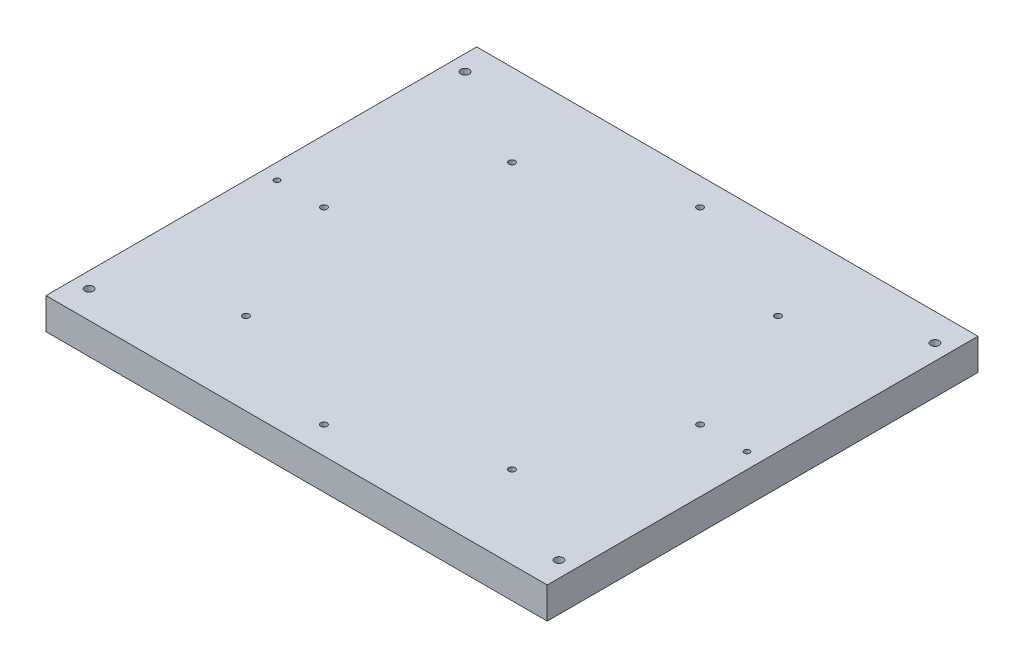
ISO-10303-21;
HEADER;
FILE_DESCRIPTION(('STEP AP214'),'2;1');
FILE_NAME('part.step','',(''),(''),'','','');
FILE_SCHEMA(('AUTOMOTIVE_DESIGN { 1 0 10303 214 1 1 1 1 }'));
ENDSEC;
DATA;
#1=APPLICATION_CONTEXT('core data for automotive mechanical design processes');
#2=APPLICATION_PROTOCOL_DEFINITION('international standard','automotive_design',2000,#1);
#3=PRODUCT_CONTEXT('',#1,'mechanical');
#4=PRODUCT('Part','Part','',(#3));
#5=PRODUCT_RELATED_PRODUCT_CATEGORY('part','',(#4));
#6=PRODUCT_DEFINITION_FORMATION('','',#4);
#7=PRODUCT_DEFINITION_CONTEXT('part definition',#1,'design');
#8=PRODUCT_DEFINITION('design','',#6,#7);
#9=PRODUCT_DEFINITION_SHAPE('','',#8);
#10=(LENGTH_UNIT() NAMED_UNIT(*) SI_UNIT(.MILLI.,.METRE.));
#11=(NAMED_UNIT(*) PLANE_ANGLE_UNIT() SI_UNIT($,.RADIAN.));
#12=(NAMED_UNIT(*) SI_UNIT($,.STERADIAN.) SOLID_ANGLE_UNIT());
#13=UNCERTAINTY_MEASURE_WITH_UNIT(LENGTH_MEASURE(1.E-05),#10,'distance_accuracy_value','');
#14=(GEOMETRIC_REPRESENTATION_CONTEXT(3) GLOBAL_UNCERTAINTY_ASSIGNED_CONTEXT((#13)) GLOBAL_UNIT_ASSIGNED_CONTEXT((#10,
#11,#12)) REPRESENTATION_CONTEXT('',''));
#15=CARTESIAN_POINT('',(0.,0.,0.));
#16=DIRECTION('',(0.,0.,1.));
#17=DIRECTION('',(1.,0.,0.));
#18=AXIS2_PLACEMENT_3D('',#15,#16,#17);
#19=CARTESIAN_POINT('',(204.7875,25.4,173.0375));
#20=DIRECTION('',(-1.,0.,0.));
#21=DIRECTION('',(0.,0.,1.));
#22=AXIS2_PLACEMENT_3D('',#19,#20,#21);
#23=PLANE('',#22);
#24=DIRECTION('',(0.,0.,-1.));
#25=VECTOR('',#24,1.);
#26=CARTESIAN_POINT('',(204.7875,0.,173.0375));
#27=LINE('',#26,#25);
#28=CARTESIAN_POINT('',(204.7875,0.,173.0375));
#29=VERTEX_POINT('',#28);
#30=CARTESIAN_POINT('',(204.7875,0.,-176.2125));
#31=VERTEX_POINT('',#30);
#32=EDGE_CURVE('E102',#29,#31,#27,.T.);
#33=ORIENTED_EDGE('',*,*,#32,.T.);
#34=DIRECTION('',(0.,-1.,0.));
#35=VECTOR('',#34,1.);
#36=CARTESIAN_POINT('',(204.7875,25.4,-176.2125));
#37=LINE('',#36,#35);
#38=CARTESIAN_POINT('',(204.7875,25.4,-176.2125));
#39=VERTEX_POINT('',#38);
#40=EDGE_CURVE('E11',#39,#31,#37,.T.);
#41=ORIENTED_EDGE('',*,*,#40,.F.);
#42=DIRECTION('',(0.,0.,-1.));
#43=VECTOR('',#42,1.);
#44=CARTESIAN_POINT('',(204.7875,25.4,173.0375));
#45=LINE('',#44,#43);
#46=CARTESIAN_POINT('',(204.7875,25.4,173.0375));
#47=VERTEX_POINT('',#46);
#48=EDGE_CURVE('E89',#47,#39,#45,.T.);
#49=ORIENTED_EDGE('',*,*,#48,.F.);
#50=DIRECTION('',(0.,-1.,0.));
#51=VECTOR('',#50,1.);
#52=CARTESIAN_POINT('',(204.7875,25.4,173.0375));
#53=LINE('',#52,#51);
#54=EDGE_CURVE('E98',#47,#29,#53,.T.);
#55=ORIENTED_EDGE('',*,*,#54,.T.);
#56=EDGE_LOOP('',(#33,#41,#49,#55));
#57=FACE_BOUND('',#56,.T.);
#58=ADVANCED_FACE('F36',(#57),#23,.F.);
#59=CARTESIAN_POINT('',(-201.6125,25.4,-176.2125));
#60=DIRECTION('',(0.,0.,1.));
#61=DIRECTION('',(1.,0.,0.));
#62=AXIS2_PLACEMENT_3D('',#59,#60,#61);
#63=PLANE('',#62);
#64=DIRECTION('',(-1.,0.,0.));
#65=VECTOR('',#64,1.);
#66=CARTESIAN_POINT('',(-201.6125,0.,-176.2125));
#67=LINE('',#66,#65);
#68=CARTESIAN_POINT('',(-201.6125,0.,-176.2125));
#69=VERTEX_POINT('',#68);
#70=EDGE_CURVE('E93',#31,#69,#67,.T.);
#71=ORIENTED_EDGE('',*,*,#70,.T.);
#72=DIRECTION('',(0.,-1.,0.));
#73=VECTOR('',#72,1.);
#74=CARTESIAN_POINT('',(-201.6125,25.4,-176.2125));
#75=LINE('',#74,#73);
#76=CARTESIAN_POINT('',(-201.6125,25.4,-176.2125));
#77=VERTEX_POINT('',#76);
#78=EDGE_CURVE('E45',#77,#69,#75,.T.);
#79=ORIENTED_EDGE('',*,*,#78,.F.);
#80=DIRECTION('',(-1.,0.,0.));
#81=VECTOR('',#80,1.);
#82=CARTESIAN_POINT('',(-201.6125,25.4,-176.2125));
#83=LINE('',#82,#81);
#84=EDGE_CURVE('E84',#39,#77,#83,.T.);
#85=ORIENTED_EDGE('',*,*,#84,.F.);
#86=ORIENTED_EDGE('',*,*,#40,.T.);
#87=EDGE_LOOP('',(#71,#79,#85,#86));
#88=FACE_BOUND('',#87,.T.);
#89=ADVANCED_FACE('F92',(#88),#63,.F.);
#90=CARTESIAN_POINT('',(-201.6125,25.4,173.0375));
#91=DIRECTION('',(1.,0.,0.));
#92=DIRECTION('',(0.,0.,-1.));
#93=AXIS2_PLACEMENT_3D('',#90,#91,#92);
#94=PLANE('',#93);
#95=DIRECTION('',(0.,0.,1.));
#96=VECTOR('',#95,1.);
#97=CARTESIAN_POINT('',(-201.6125,0.,173.0375));
#98=LINE('',#97,#96);
#99=CARTESIAN_POINT('',(-201.6125,0.,173.0375));
#100=VERTEX_POINT('',#99);
#101=EDGE_CURVE('E71',#69,#100,#98,.T.);
#102=ORIENTED_EDGE('',*,*,#101,.T.);
#103=DIRECTION('',(0.,-1.,0.));
#104=VECTOR('',#103,1.);
#105=CARTESIAN_POINT('',(-201.6125,25.4,173.0375));
#106=LINE('',#105,#104);
#107=CARTESIAN_POINT('',(-201.6125,25.4,173.0375));
#108=VERTEX_POINT('',#107);
#109=EDGE_CURVE('E94',#108,#100,#106,.T.);
#110=ORIENTED_EDGE('',*,*,#109,.F.);
#111=DIRECTION('',(0.,0.,1.));
#112=VECTOR('',#111,1.);
#113=CARTESIAN_POINT('',(-201.6125,25.4,173.0375));
#114=LINE('',#113,#112);
#115=EDGE_CURVE('E87',#77,#108,#114,.T.);
#116=ORIENTED_EDGE('',*,*,#115,.F.);
#117=ORIENTED_EDGE('',*,*,#78,.T.);
#118=EDGE_LOOP('',(#102,#110,#116,#117));
#119=FACE_BOUND('',#118,.T.);
#120=ADVANCED_FACE('F96',(#119),#94,.F.);
#121=CARTESIAN_POINT('',(-201.6125,25.4,173.0375));
#122=DIRECTION('',(0.,0.,-1.));
#123=DIRECTION('',(-1.,0.,0.));
#124=AXIS2_PLACEMENT_3D('',#121,#122,#123);
#125=PLANE('',#124);
#126=DIRECTION('',(1.,0.,0.));
#127=VECTOR('',#126,1.);
#128=CARTESIAN_POINT('',(-201.6125,0.,173.0375));
#129=LINE('',#128,#127);
#130=EDGE_CURVE('E77',#100,#29,#129,.T.);
#131=ORIENTED_EDGE('',*,*,#130,.T.);
#132=ORIENTED_EDGE('',*,*,#54,.F.);
#133=DIRECTION('',(1.,0.,0.));
#134=VECTOR('',#133,1.);
#135=CARTESIAN_POINT('',(-201.6125,25.4,173.0375));
#136=LINE('',#135,#134);
#137=EDGE_CURVE('E54',#108,#47,#136,.T.);
#138=ORIENTED_EDGE('',*,*,#137,.F.);
#139=ORIENTED_EDGE('',*,*,#109,.T.);
#140=EDGE_LOOP('',(#131,#132,#138,#139));
#141=FACE_BOUND('',#140,.T.);
#142=ADVANCED_FACE('F205',(#141),#125,.F.);
#143=CARTESIAN_POINT('',(204.7875,25.4,-176.2125));
#144=DIRECTION('',(0.,-1.,0.));
#145=DIRECTION('',(0.,0.,-1.));
#146=AXIS2_PLACEMENT_3D('',#143,#144,#145);
#147=PLANE('',#146);
#148=CARTESIAN_POINT('',(1.58749999999996,25.4,-154.072248935754));
#149=DIRECTION('',(0.,1.,0.));
#150=DIRECTION('',(0.,0.,1.));
#151=AXIS2_PLACEMENT_3D('',#148,#149,#150);
#152=CIRCLE('',#151,2.55269999999999);
#153=CARTESIAN_POINT('',(1.58749999999996,25.4,-151.519548935754));
#154=VERTEX_POINT('',#153);
#155=EDGE_CURVE('E156',#154,#154,#152,.T.);
#156=ORIENTED_EDGE('',*,*,#155,.F.);
#157=EDGE_LOOP('',(#156));
#158=FACE_BOUND('',#157,.T.);
#159=CARTESIAN_POINT('',(-106.2355,25.4,-109.4105));
#160=DIRECTION('',(0.,1.,0.));
#161=DIRECTION('',(0.,0.,1.));
#162=AXIS2_PLACEMENT_3D('',#159,#160,#161);
#163=CIRCLE('',#162,2.55269999999999);
#164=CARTESIAN_POINT('',(-106.2355,25.4,-106.8578));
#165=VERTEX_POINT('',#164);
#166=EDGE_CURVE('E146',#165,#165,#163,.T.);
#167=ORIENTED_EDGE('',*,*,#166,.F.);
#168=EDGE_LOOP('',(#167));
#169=FACE_BOUND('',#168,.T.);
#170=CARTESIAN_POINT('',(109.4105,25.4,-109.4105));
#171=DIRECTION('',(0.,1.,0.));
#172=DIRECTION('',(0.,0.,1.));
#173=AXIS2_PLACEMENT_3D('',#170,#171,#172);
#174=CIRCLE('',#173,2.55269999999999);
#175=CARTESIAN_POINT('',(109.4105,25.4,-106.8578));
#176=VERTEX_POINT('',#175);
#177=EDGE_CURVE('E143',#176,#176,#174,.T.);
#178=ORIENTED_EDGE('',*,*,#177,.F.);
#179=EDGE_LOOP('',(#178));
#180=FACE_BOUND('',#179,.T.);
#181=CARTESIAN_POINT('',(154.072248935754,25.4,-1.58750000000007));
#182=DIRECTION('',(0.,1.,0.));
#183=DIRECTION('',(0.,0.,1.));
#184=AXIS2_PLACEMENT_3D('',#181,#182,#183);
#185=CIRCLE('',#184,2.55269999999999);
#186=CARTESIAN_POINT('',(154.072248935754,25.4,0.965199999999916));
#187=VERTEX_POINT('',#186);
#188=EDGE_CURVE('E140',#187,#187,#185,.T.);
#189=ORIENTED_EDGE('',*,*,#188,.F.);
#190=EDGE_LOOP('',(#189));
#191=FACE_BOUND('',#190,.T.);
#192=CARTESIAN_POINT('',(-150.897248935754,25.4,-1.58750000000005));
#193=DIRECTION('',(0.,1.,0.));
#194=DIRECTION('',(0.,0.,1.));
#195=AXIS2_PLACEMENT_3D('',#192,#193,#194);
#196=CIRCLE('',#195,2.55269999999999);
#197=CARTESIAN_POINT('',(-150.897248935754,25.4,0.965199999999944));
#198=VERTEX_POINT('',#197);
#199=EDGE_CURVE('E136',#198,#198,#196,.T.);
#200=ORIENTED_EDGE('',*,*,#199,.F.);
#201=EDGE_LOOP('',(#200));
#202=FACE_BOUND('',#201,.T.);
#203=CARTESIAN_POINT('',(-106.2355,25.4,106.2355));
#204=DIRECTION('',(0.,1.,0.));
#205=DIRECTION('',(0.,0.,1.));
#206=AXIS2_PLACEMENT_3D('',#203,#204,#205);
#207=CIRCLE('',#206,2.55269999999999);
#208=CARTESIAN_POINT('',(-106.2355,25.4,108.7882));
#209=VERTEX_POINT('',#208);
#210=EDGE_CURVE('E135',#209,#209,#207,.T.);
#211=ORIENTED_EDGE('',*,*,#210,.F.);
#212=EDGE_LOOP('',(#211));
#213=FACE_BOUND('',#212,.T.);
#214=CARTESIAN_POINT('',(1.58749999999996,25.4,150.897248935754));
#215=DIRECTION('',(0.,1.,0.));
#216=DIRECTION('',(0.,0.,1.));
#217=AXIS2_PLACEMENT_3D('',#214,#215,#216);
#218=CIRCLE('',#217,2.55269999999999);
#219=CARTESIAN_POINT('',(1.58749999999996,25.4,153.449948935754));
#220=VERTEX_POINT('',#219);
#221=EDGE_CURVE('E168',#220,#220,#218,.T.);
#222=ORIENTED_EDGE('',*,*,#221,.F.);
#223=EDGE_LOOP('',(#222));
#224=FACE_BOUND('',#223,.T.);
#225=CARTESIAN_POINT('',(109.4105,25.4,106.2355));
#226=DIRECTION('',(0.,1.,0.));
#227=DIRECTION('',(0.,0.,1.));
#228=AXIS2_PLACEMENT_3D('',#225,#226,#227);
#229=CIRCLE('',#228,2.55269999999999);
#230=CARTESIAN_POINT('',(109.4105,25.4,108.7882));
#231=VERTEX_POINT('',#230);
#232=EDGE_CURVE('E174',#231,#231,#229,.T.);
#233=ORIENTED_EDGE('',*,*,#232,.F.);
#234=EDGE_LOOP('',(#233));
#235=FACE_BOUND('',#234,.T.);
#236=CARTESIAN_POINT('',(-188.9125,25.4,-1.58750000000002));
#237=DIRECTION('',(0.,1.,0.));
#238=DIRECTION('',(0.,0.,1.));
#239=AXIS2_PLACEMENT_3D('',#236,#237,#238);
#240=CIRCLE('',#239,2.2479);
#241=CARTESIAN_POINT('',(-188.9125,25.4,0.660399999999973));
#242=VERTEX_POINT('',#241);
#243=EDGE_CURVE('E131',#242,#242,#240,.T.);
#244=ORIENTED_EDGE('',*,*,#243,.F.);
#245=EDGE_LOOP('',(#244));
#246=FACE_BOUND('',#245,.T.);
#247=CARTESIAN_POINT('',(192.0875,25.4,-1.58750000000005));
#248=DIRECTION('',(0.,1.,0.));
#249=DIRECTION('',(0.,0.,1.));
#250=AXIS2_PLACEMENT_3D('',#247,#248,#249);
#251=CIRCLE('',#250,2.2479);
#252=CARTESIAN_POINT('',(192.0875,25.4,0.66039999999995));
#253=VERTEX_POINT('',#252);
#254=EDGE_CURVE('E127',#253,#253,#251,.T.);
#255=ORIENTED_EDGE('',*,*,#254,.F.);
#256=EDGE_LOOP('',(#255));
#257=FACE_BOUND('',#256,.T.);
#258=CARTESIAN_POINT('',(-188.9125,25.4,-153.9875));
#259=DIRECTION('',(0.,1.,0.));
#260=DIRECTION('',(0.,0.,1.));
#261=AXIS2_PLACEMENT_3D('',#258,#259,#260);
#262=CIRCLE('',#261,3.3782);
#263=CARTESIAN_POINT('',(-188.9125,25.4,-150.6093));
#264=VERTEX_POINT('',#263);
#265=EDGE_CURVE('E123',#264,#264,#262,.T.);
#266=ORIENTED_EDGE('',*,*,#265,.F.);
#267=EDGE_LOOP('',(#266));
#268=FACE_BOUND('',#267,.T.);
#269=CARTESIAN_POINT('',(192.0875,25.4,-153.9875));
#270=DIRECTION('',(0.,1.,0.));
#271=DIRECTION('',(0.,0.,1.));
#272=AXIS2_PLACEMENT_3D('',#269,#270,#271);
#273=CIRCLE('',#272,3.3782);
#274=CARTESIAN_POINT('',(192.0875,25.4,-150.6093));
#275=VERTEX_POINT('',#274);
#276=EDGE_CURVE('E119',#275,#275,#273,.T.);
#277=ORIENTED_EDGE('',*,*,#276,.F.);
#278=EDGE_LOOP('',(#277));
#279=FACE_BOUND('',#278,.T.);
#280=CARTESIAN_POINT('',(192.0875,25.4,150.8125));
#281=DIRECTION('',(0.,1.,0.));
#282=DIRECTION('',(0.,0.,1.));
#283=AXIS2_PLACEMENT_3D('',#280,#281,#282);
#284=CIRCLE('',#283,3.3782);
#285=CARTESIAN_POINT('',(192.0875,25.4,154.1907));
#286=VERTEX_POINT('',#285);
#287=EDGE_CURVE('E115',#286,#286,#284,.T.);
#288=ORIENTED_EDGE('',*,*,#287,.F.);
#289=EDGE_LOOP('',(#288));
#290=FACE_BOUND('',#289,.T.);
#291=CARTESIAN_POINT('',(-188.9125,25.4,150.8125));
#292=DIRECTION('',(0.,1.,0.));
#293=DIRECTION('',(0.,0.,1.));
#294=AXIS2_PLACEMENT_3D('',#291,#292,#293);
#295=CIRCLE('',#294,3.3782);
#296=CARTESIAN_POINT('',(-188.9125,25.4,154.1907));
#297=VERTEX_POINT('',#296);
#298=EDGE_CURVE('E114',#297,#297,#295,.T.);
#299=ORIENTED_EDGE('',*,*,#298,.F.);
#300=EDGE_LOOP('',(#299));
#301=FACE_BOUND('',#300,.T.);
#302=ORIENTED_EDGE('',*,*,#48,.T.);
#303=ORIENTED_EDGE('',*,*,#84,.T.);
#304=ORIENTED_EDGE('',*,*,#115,.T.);
#305=ORIENTED_EDGE('',*,*,#137,.T.);
#306=EDGE_LOOP('',(#302,#303,#304,#305));
#307=FACE_BOUND('',#306,.T.);
#308=ADVANCED_FACE('F85',(#158,#169,#180,#191,#202,#213,#224,#235,#246,#257,#268,#279,#290,#301,
#307),#147,.F.);
#309=CARTESIAN_POINT('',(204.7875,0.,-176.2125));
#310=DIRECTION('',(0.,-1.,0.));
#311=DIRECTION('',(0.,0.,-1.));
#312=AXIS2_PLACEMENT_3D('',#309,#310,#311);
#313=PLANE('',#312);
#314=CARTESIAN_POINT('',(1.58749999999996,0.,-154.072248935754));
#315=DIRECTION('',(0.,-1.,0.));
#316=DIRECTION('',(0.,0.,-1.));
#317=AXIS2_PLACEMENT_3D('',#314,#315,#316);
#318=CIRCLE('',#317,2.55269999999999);
#319=CARTESIAN_POINT('',(1.58749999999996,0.,-156.624948935754));
#320=VERTEX_POINT('',#319);
#321=EDGE_CURVE('E39',#320,#320,#318,.T.);
#322=ORIENTED_EDGE('',*,*,#321,.F.);
#323=EDGE_LOOP('',(#322));
#324=FACE_BOUND('',#323,.T.);
#325=CARTESIAN_POINT('',(-106.2355,0.,-109.4105));
#326=DIRECTION('',(0.,-1.,0.));
#327=DIRECTION('',(0.,0.,-1.));
#328=AXIS2_PLACEMENT_3D('',#325,#326,#327);
#329=CIRCLE('',#328,2.55269999999998);
#330=CARTESIAN_POINT('',(-106.2355,0.,-111.9632));
#331=VERTEX_POINT('',#330);
#332=EDGE_CURVE('E144',#331,#331,#329,.T.);
#333=ORIENTED_EDGE('',*,*,#332,.F.);
#334=EDGE_LOOP('',(#333));
#335=FACE_BOUND('',#334,.T.);
#336=CARTESIAN_POINT('',(109.4105,0.,-109.4105));
#337=DIRECTION('',(0.,-1.,0.));
#338=DIRECTION('',(0.,0.,-1.));
#339=AXIS2_PLACEMENT_3D('',#336,#337,#338);
#340=CIRCLE('',#339,2.55269999999998);
#341=CARTESIAN_POINT('',(109.4105,0.,-111.9632));
#342=VERTEX_POINT('',#341);
#343=EDGE_CURVE('E141',#342,#342,#340,.T.);
#344=ORIENTED_EDGE('',*,*,#343,.F.);
#345=EDGE_LOOP('',(#344));
#346=FACE_BOUND('',#345,.T.);
#347=CARTESIAN_POINT('',(154.072248935754,0.,-1.58750000000007));
#348=DIRECTION('',(0.,-1.,0.));
#349=DIRECTION('',(0.,0.,-1.));
#350=AXIS2_PLACEMENT_3D('',#347,#348,#349);
#351=CIRCLE('',#350,2.55269999999999);
#352=CARTESIAN_POINT('',(154.072248935754,0.,-4.14020000000007));
#353=VERTEX_POINT('',#352);
#354=EDGE_CURVE('E137',#353,#353,#351,.T.);
#355=ORIENTED_EDGE('',*,*,#354,.F.);
#356=EDGE_LOOP('',(#355));
#357=FACE_BOUND('',#356,.T.);
#358=CARTESIAN_POINT('',(-150.897248935754,0.,-1.58750000000005));
#359=DIRECTION('',(0.,-1.,0.));
#360=DIRECTION('',(0.,0.,-1.));
#361=AXIS2_PLACEMENT_3D('',#358,#359,#360);
#362=CIRCLE('',#361,2.55269999999999);
#363=CARTESIAN_POINT('',(-150.897248935754,0.,-4.14020000000004));
#364=VERTEX_POINT('',#363);
#365=EDGE_CURVE('E132',#364,#364,#362,.T.);
#366=ORIENTED_EDGE('',*,*,#365,.F.);
#367=EDGE_LOOP('',(#366));
#368=FACE_BOUND('',#367,.T.);
#369=CARTESIAN_POINT('',(-106.2355,0.,106.2355));
#370=DIRECTION('',(0.,-1.,0.));
#371=DIRECTION('',(0.,0.,-1.));
#372=AXIS2_PLACEMENT_3D('',#369,#370,#371);
#373=CIRCLE('',#372,2.55269999999998);
#374=CARTESIAN_POINT('',(-106.2355,0.,103.6828));
#375=VERTEX_POINT('',#374);
#376=EDGE_CURVE('E165',#375,#375,#373,.T.);
#377=ORIENTED_EDGE('',*,*,#376,.F.);
#378=EDGE_LOOP('',(#377));
#379=FACE_BOUND('',#378,.T.);
#380=CARTESIAN_POINT('',(1.58749999999996,0.,150.897248935754));
#381=DIRECTION('',(0.,-1.,0.));
#382=DIRECTION('',(0.,0.,-1.));
#383=AXIS2_PLACEMENT_3D('',#380,#381,#382);
#384=CIRCLE('',#383,2.55269999999999);
#385=CARTESIAN_POINT('',(1.58749999999996,0.,148.344548935754));
#386=VERTEX_POINT('',#385);
#387=EDGE_CURVE('E171',#386,#386,#384,.T.);
#388=ORIENTED_EDGE('',*,*,#387,.F.);
#389=EDGE_LOOP('',(#388));
#390=FACE_BOUND('',#389,.T.);
#391=CARTESIAN_POINT('',(109.4105,0.,106.2355));
#392=DIRECTION('',(0.,-1.,0.));
#393=DIRECTION('',(0.,0.,-1.));
#394=AXIS2_PLACEMENT_3D('',#391,#392,#393);
#395=CIRCLE('',#394,2.55269999999998);
#396=CARTESIAN_POINT('',(109.4105,0.,103.6828));
#397=VERTEX_POINT('',#396);
#398=EDGE_CURVE('E177',#397,#397,#395,.T.);
#399=ORIENTED_EDGE('',*,*,#398,.F.);
#400=EDGE_LOOP('',(#399));
#401=FACE_BOUND('',#400,.T.);
#402=CARTESIAN_POINT('',(-188.9125,0.,-1.58750000000002));
#403=DIRECTION('',(0.,-1.,0.));
#404=DIRECTION('',(0.,0.,-1.));
#405=AXIS2_PLACEMENT_3D('',#402,#403,#404);
#406=CIRCLE('',#405,2.24789999999998);
#407=CARTESIAN_POINT('',(-188.9125,0.,-3.83540000000001));
#408=VERTEX_POINT('',#407);
#409=EDGE_CURVE('E128',#408,#408,#406,.T.);
#410=ORIENTED_EDGE('',*,*,#409,.F.);
#411=EDGE_LOOP('',(#410));
#412=FACE_BOUND('',#411,.T.);
#413=CARTESIAN_POINT('',(192.0875,0.,-1.58750000000005));
#414=DIRECTION('',(0.,-1.,0.));
#415=DIRECTION('',(0.,0.,-1.));
#416=AXIS2_PLACEMENT_3D('',#413,#414,#415);
#417=CIRCLE('',#416,2.24789999999998);
#418=CARTESIAN_POINT('',(192.0875,0.,-3.83540000000003));
#419=VERTEX_POINT('',#418);
#420=EDGE_CURVE('E124',#419,#419,#417,.T.);
#421=ORIENTED_EDGE('',*,*,#420,.F.);
#422=EDGE_LOOP('',(#421));
#423=FACE_BOUND('',#422,.T.);
#424=CARTESIAN_POINT('',(-188.9125,0.,-153.9875));
#425=DIRECTION('',(0.,-1.,0.));
#426=DIRECTION('',(0.,0.,-1.));
#427=AXIS2_PLACEMENT_3D('',#424,#425,#426);
#428=CIRCLE('',#427,3.37819999999998);
#429=CARTESIAN_POINT('',(-188.9125,0.,-157.3657));
#430=VERTEX_POINT('',#429);
#431=EDGE_CURVE('E120',#430,#430,#428,.T.);
#432=ORIENTED_EDGE('',*,*,#431,.F.);
#433=EDGE_LOOP('',(#432));
#434=FACE_BOUND('',#433,.T.);
#435=CARTESIAN_POINT('',(192.0875,0.,-153.9875));
#436=DIRECTION('',(0.,-1.,0.));
#437=DIRECTION('',(0.,0.,-1.));
#438=AXIS2_PLACEMENT_3D('',#435,#436,#437);
#439=CIRCLE('',#438,3.37819999999998);
#440=CARTESIAN_POINT('',(192.0875,0.,-157.3657));
#441=VERTEX_POINT('',#440);
#442=EDGE_CURVE('E116',#441,#441,#439,.T.);
#443=ORIENTED_EDGE('',*,*,#442,.F.);
#444=EDGE_LOOP('',(#443));
#445=FACE_BOUND('',#444,.T.);
#446=CARTESIAN_POINT('',(192.0875,0.,150.8125));
#447=DIRECTION('',(0.,-1.,0.));
#448=DIRECTION('',(0.,0.,-1.));
#449=AXIS2_PLACEMENT_3D('',#446,#447,#448);
#450=CIRCLE('',#449,3.37819999999998);
#451=CARTESIAN_POINT('',(192.0875,0.,147.4343));
#452=VERTEX_POINT('',#451);
#453=EDGE_CURVE('E111',#452,#452,#450,.T.);
#454=ORIENTED_EDGE('',*,*,#453,.F.);
#455=EDGE_LOOP('',(#454));
#456=FACE_BOUND('',#455,.T.);
#457=CARTESIAN_POINT('',(-188.9125,0.,150.8125));
#458=DIRECTION('',(0.,-1.,0.));
#459=DIRECTION('',(0.,0.,-1.));
#460=AXIS2_PLACEMENT_3D('',#457,#458,#459);
#461=CIRCLE('',#460,3.37819999999998);
#462=CARTESIAN_POINT('',(-188.9125,0.,147.4343));
#463=VERTEX_POINT('',#462);
#464=EDGE_CURVE('E105',#463,#463,#461,.T.);
#465=ORIENTED_EDGE('',*,*,#464,.F.);
#466=EDGE_LOOP('',(#465));
#467=FACE_BOUND('',#466,.T.);
#468=ORIENTED_EDGE('',*,*,#32,.F.);
#469=ORIENTED_EDGE('',*,*,#130,.F.);
#470=ORIENTED_EDGE('',*,*,#101,.F.);
#471=ORIENTED_EDGE('',*,*,#70,.F.);
#472=EDGE_LOOP('',(#468,#469,#470,#471));
#473=FACE_BOUND('',#472,.T.);
#474=ADVANCED_FACE('F198',(#324,#335,#346,#357,#368,#379,#390,#401,#412,#423,#434,#445,#456,
#467,#473),#313,.T.);
#475=CARTESIAN_POINT('',(-188.9125,25.4,150.8125));
#476=DIRECTION('',(0.,1.,0.));
#477=DIRECTION('',(0.,0.,1.));
#478=AXIS2_PLACEMENT_3D('',#475,#476,#477);
#479=CYLINDRICAL_SURFACE('',#478,3.37819999999998);
#480=ORIENTED_EDGE('',*,*,#464,.T.);
#481=EDGE_LOOP('',(#480));
#482=FACE_BOUND('',#481,.T.);
#483=ORIENTED_EDGE('',*,*,#298,.T.);
#484=EDGE_LOOP('',(#483));
#485=FACE_BOUND('',#484,.T.);
#486=ADVANCED_FACE('F195',(#482,#485),#479,.F.);
#487=CARTESIAN_POINT('',(192.0875,25.4,150.8125));
#488=DIRECTION('',(0.,1.,0.));
#489=DIRECTION('',(0.,0.,1.));
#490=AXIS2_PLACEMENT_3D('',#487,#488,#489);
#491=CYLINDRICAL_SURFACE('',#490,3.37819999999998);
#492=ORIENTED_EDGE('',*,*,#453,.T.);
#493=EDGE_LOOP('',(#492));
#494=FACE_BOUND('',#493,.T.);
#495=ORIENTED_EDGE('',*,*,#287,.T.);
#496=EDGE_LOOP('',(#495));
#497=FACE_BOUND('',#496,.T.);
#498=ADVANCED_FACE('F239',(#494,#497),#491,.F.);
#499=CARTESIAN_POINT('',(192.0875,25.4,-153.9875));
#500=DIRECTION('',(0.,1.,0.));
#501=DIRECTION('',(0.,0.,1.));
#502=AXIS2_PLACEMENT_3D('',#499,#500,#501);
#503=CYLINDRICAL_SURFACE('',#502,3.37819999999998);
#504=ORIENTED_EDGE('',*,*,#442,.T.);
#505=EDGE_LOOP('',(#504));
#506=FACE_BOUND('',#505,.T.);
#507=ORIENTED_EDGE('',*,*,#276,.T.);
#508=EDGE_LOOP('',(#507));
#509=FACE_BOUND('',#508,.T.);
#510=ADVANCED_FACE('F249',(#506,#509),#503,.F.);
#511=CARTESIAN_POINT('',(-188.9125,25.4,-153.9875));
#512=DIRECTION('',(0.,1.,0.));
#513=DIRECTION('',(0.,0.,1.));
#514=AXIS2_PLACEMENT_3D('',#511,#512,#513);
#515=CYLINDRICAL_SURFACE('',#514,3.37819999999998);
#516=ORIENTED_EDGE('',*,*,#431,.T.);
#517=EDGE_LOOP('',(#516));
#518=FACE_BOUND('',#517,.T.);
#519=ORIENTED_EDGE('',*,*,#265,.T.);
#520=EDGE_LOOP('',(#519));
#521=FACE_BOUND('',#520,.T.);
#522=ADVANCED_FACE('F259',(#518,#521),#515,.F.);
#523=CARTESIAN_POINT('',(192.0875,25.4,-1.58750000000005));
#524=DIRECTION('',(0.,1.,0.));
#525=DIRECTION('',(0.,0.,1.));
#526=AXIS2_PLACEMENT_3D('',#523,#524,#525);
#527=CYLINDRICAL_SURFACE('',#526,2.24789999999998);
#528=ORIENTED_EDGE('',*,*,#420,.T.);
#529=EDGE_LOOP('',(#528));
#530=FACE_BOUND('',#529,.T.);
#531=ORIENTED_EDGE('',*,*,#254,.T.);
#532=EDGE_LOOP('',(#531));
#533=FACE_BOUND('',#532,.T.);
#534=ADVANCED_FACE('F269',(#530,#533),#527,.F.);
#535=CARTESIAN_POINT('',(-188.9125,25.4,-1.58750000000002));
#536=DIRECTION('',(0.,1.,0.));
#537=DIRECTION('',(0.,0.,1.));
#538=AXIS2_PLACEMENT_3D('',#535,#536,#537);
#539=CYLINDRICAL_SURFACE('',#538,2.24789999999998);
#540=ORIENTED_EDGE('',*,*,#409,.T.);
#541=EDGE_LOOP('',(#540));
#542=FACE_BOUND('',#541,.T.);
#543=ORIENTED_EDGE('',*,*,#243,.T.);
#544=EDGE_LOOP('',(#543));
#545=FACE_BOUND('',#544,.T.);
#546=ADVANCED_FACE('F279',(#542,#545),#539,.F.);
#547=CARTESIAN_POINT('',(109.4105,25.4,106.2355));
#548=DIRECTION('',(0.,1.,0.));
#549=DIRECTION('',(0.,0.,1.));
#550=AXIS2_PLACEMENT_3D('',#547,#548,#549);
#551=CYLINDRICAL_SURFACE('',#550,2.55269999999998);
#552=ORIENTED_EDGE('',*,*,#398,.T.);
#553=EDGE_LOOP('',(#552));
#554=FACE_BOUND('',#553,.T.);
#555=ORIENTED_EDGE('',*,*,#232,.T.);
#556=EDGE_LOOP('',(#555));
#557=FACE_BOUND('',#556,.T.);
#558=ADVANCED_FACE('F289',(#554,#557),#551,.F.);
#559=CARTESIAN_POINT('',(1.58749999999996,25.4,150.897248935754));
#560=DIRECTION('',(0.,1.,0.));
#561=DIRECTION('',(0.,0.,1.));
#562=AXIS2_PLACEMENT_3D('',#559,#560,#561);
#563=CYLINDRICAL_SURFACE('',#562,2.55269999999999);
#564=ORIENTED_EDGE('',*,*,#387,.T.);
#565=EDGE_LOOP('',(#564));
#566=FACE_BOUND('',#565,.T.);
#567=ORIENTED_EDGE('',*,*,#221,.T.);
#568=EDGE_LOOP('',(#567));
#569=FACE_BOUND('',#568,.T.);
#570=ADVANCED_FACE('F310',(#566,#569),#563,.F.);
#571=CARTESIAN_POINT('',(-106.2355,25.4,106.2355));
#572=DIRECTION('',(0.,1.,0.));
#573=DIRECTION('',(0.,0.,1.));
#574=AXIS2_PLACEMENT_3D('',#571,#572,#573);
#575=CYLINDRICAL_SURFACE('',#574,2.55269999999998);
#576=ORIENTED_EDGE('',*,*,#376,.T.);
#577=EDGE_LOOP('',(#576));
#578=FACE_BOUND('',#577,.T.);
#579=ORIENTED_EDGE('',*,*,#210,.T.);
#580=EDGE_LOOP('',(#579));
#581=FACE_BOUND('',#580,.T.);
#582=ADVANCED_FACE('F322',(#578,#581),#575,.F.);
#583=CARTESIAN_POINT('',(-150.897248935754,25.4,-1.58750000000005));
#584=DIRECTION('',(0.,1.,0.));
#585=DIRECTION('',(0.,0.,1.));
#586=AXIS2_PLACEMENT_3D('',#583,#584,#585);
#587=CYLINDRICAL_SURFACE('',#586,2.55269999999999);
#588=ORIENTED_EDGE('',*,*,#365,.T.);
#589=EDGE_LOOP('',(#588));
#590=FACE_BOUND('',#589,.T.);
#591=ORIENTED_EDGE('',*,*,#199,.T.);
#592=EDGE_LOOP('',(#591));
#593=FACE_BOUND('',#592,.T.);
#594=ADVANCED_FACE('F334',(#590,#593),#587,.F.);
#595=CARTESIAN_POINT('',(154.072248935754,25.4,-1.58750000000007));
#596=DIRECTION('',(0.,1.,0.));
#597=DIRECTION('',(0.,0.,1.));
#598=AXIS2_PLACEMENT_3D('',#595,#596,#597);
#599=CYLINDRICAL_SURFACE('',#598,2.55269999999999);
#600=ORIENTED_EDGE('',*,*,#354,.T.);
#601=EDGE_LOOP('',(#600));
#602=FACE_BOUND('',#601,.T.);
#603=ORIENTED_EDGE('',*,*,#188,.T.);
#604=EDGE_LOOP('',(#603));
#605=FACE_BOUND('',#604,.T.);
#606=ADVANCED_FACE('F346',(#602,#605),#599,.F.);
#607=CARTESIAN_POINT('',(109.4105,25.4,-109.4105));
#608=DIRECTION('',(0.,1.,0.));
#609=DIRECTION('',(0.,0.,1.));
#610=AXIS2_PLACEMENT_3D('',#607,#608,#609);
#611=CYLINDRICAL_SURFACE('',#610,2.55269999999998);
#612=ORIENTED_EDGE('',*,*,#343,.T.);
#613=EDGE_LOOP('',(#612));
#614=FACE_BOUND('',#613,.T.);
#615=ORIENTED_EDGE('',*,*,#177,.T.);
#616=EDGE_LOOP('',(#615));
#617=FACE_BOUND('',#616,.T.);
#618=ADVANCED_FACE('F358',(#614,#617),#611,.F.);
#619=CARTESIAN_POINT('',(-106.2355,25.4,-109.4105));
#620=DIRECTION('',(0.,1.,0.));
#621=DIRECTION('',(0.,0.,1.));
#622=AXIS2_PLACEMENT_3D('',#619,#620,#621);
#623=CYLINDRICAL_SURFACE('',#622,2.55269999999998);
#624=ORIENTED_EDGE('',*,*,#332,.T.);
#625=EDGE_LOOP('',(#624));
#626=FACE_BOUND('',#625,.T.);
#627=ORIENTED_EDGE('',*,*,#166,.T.);
#628=EDGE_LOOP('',(#627));
#629=FACE_BOUND('',#628,.T.);
#630=ADVANCED_FACE('F370',(#626,#629),#623,.F.);
#631=CARTESIAN_POINT('',(1.58749999999996,25.4,-154.072248935754));
#632=DIRECTION('',(0.,1.,0.));
#633=DIRECTION('',(0.,0.,1.));
#634=AXIS2_PLACEMENT_3D('',#631,#632,#633);
#635=CYLINDRICAL_SURFACE('',#634,2.55269999999999);
#636=ORIENTED_EDGE('',*,*,#321,.T.);
#637=EDGE_LOOP('',(#636));
#638=FACE_BOUND('',#637,.T.);
#639=ORIENTED_EDGE('',*,*,#155,.T.);
#640=EDGE_LOOP('',(#639));
#641=FACE_BOUND('',#640,.T.);
#642=ADVANCED_FACE('F382',(#638,#641),#635,.F.);
#643=CLOSED_SHELL('',(#58,#89,#120,#142,#308,#474,#486,#498,#510,#522,#534,#546,#558,#570,#582,
#594,#606,#618,#630,#642));
#644=MANIFOLD_SOLID_BREP('B2',#643);
#645=ADVANCED_BREP_SHAPE_REPRESENTATION('',(#18,#644),#14);
#646=SHAPE_DEFINITION_REPRESENTATION(#9,#645);
ENDSEC;
END-ISO-10303-21;
